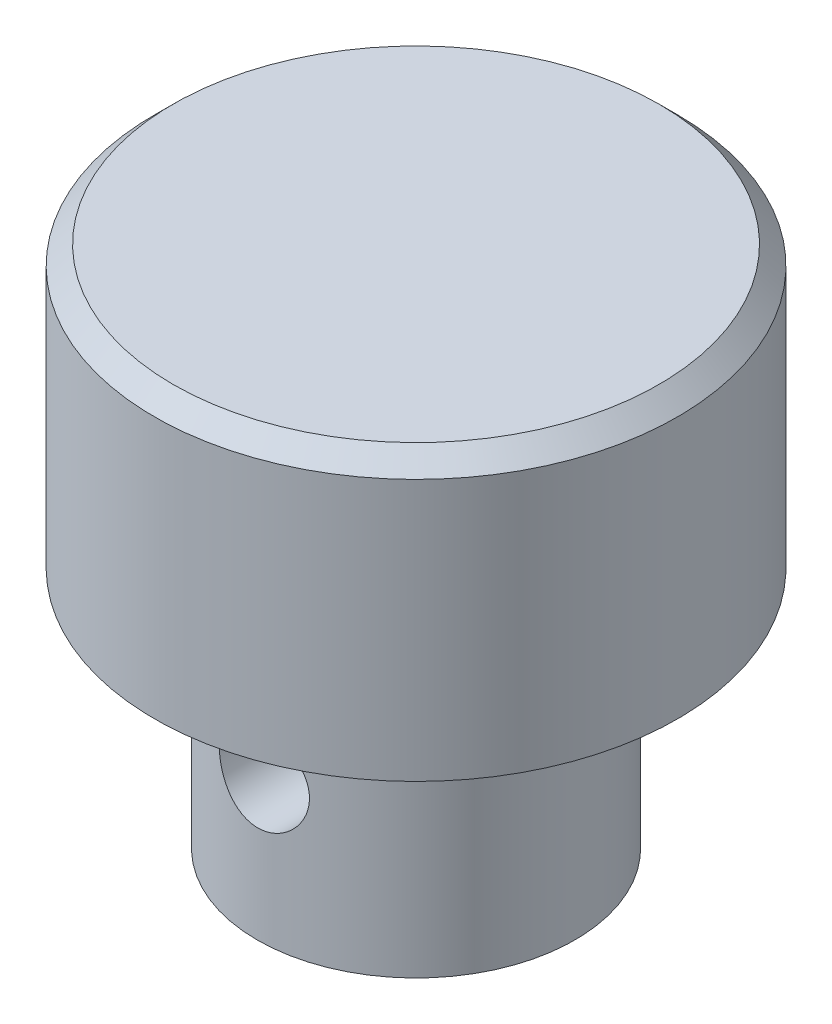
ISO-10303-21;
HEADER;
FILE_DESCRIPTION(('STEP AP214'),'2;1');
FILE_NAME('part.step','',(''),(''),'','','');
FILE_SCHEMA(('AUTOMOTIVE_DESIGN { 1 0 10303 214 1 1 1 1 }'));
ENDSEC;
DATA;
#1=APPLICATION_CONTEXT('core data for automotive mechanical design processes');
#2=APPLICATION_PROTOCOL_DEFINITION('international standard','automotive_design',2000,#1);
#3=PRODUCT_CONTEXT('',#1,'mechanical');
#4=PRODUCT('Part','Part','',(#3));
#5=PRODUCT_RELATED_PRODUCT_CATEGORY('part','',(#4));
#6=PRODUCT_DEFINITION_FORMATION('','',#4);
#7=PRODUCT_DEFINITION_CONTEXT('part definition',#1,'design');
#8=PRODUCT_DEFINITION('design','',#6,#7);
#9=PRODUCT_DEFINITION_SHAPE('','',#8);
#10=(LENGTH_UNIT() NAMED_UNIT(*) SI_UNIT(.MILLI.,.METRE.));
#11=(NAMED_UNIT(*) PLANE_ANGLE_UNIT() SI_UNIT($,.RADIAN.));
#12=(NAMED_UNIT(*) SI_UNIT($,.STERADIAN.) SOLID_ANGLE_UNIT());
#13=UNCERTAINTY_MEASURE_WITH_UNIT(LENGTH_MEASURE(1.E-05),#10,'distance_accuracy_value','');
#14=(GEOMETRIC_REPRESENTATION_CONTEXT(3) GLOBAL_UNCERTAINTY_ASSIGNED_CONTEXT((#13)) GLOBAL_UNIT_ASSIGNED_CONTEXT((#10,
#11,#12)) REPRESENTATION_CONTEXT('',''));
#15=CARTESIAN_POINT('',(0.,0.,0.));
#16=DIRECTION('',(0.,0.,1.));
#17=DIRECTION('',(1.,0.,0.));
#18=AXIS2_PLACEMENT_3D('',#15,#16,#17);
#19=CARTESIAN_POINT('',(0.,14.,0.));
#20=DIRECTION('',(0.,-1.,0.));
#21=DIRECTION('',(0.,0.,-1.));
#22=AXIS2_PLACEMENT_3D('',#19,#20,#21);
#23=PLANE('',#22);
#24=CARTESIAN_POINT('',(0.,14.,0.));
#25=DIRECTION('',(0.,-1.,0.));
#26=DIRECTION('',(0.,0.,-1.));
#27=AXIS2_PLACEMENT_3D('',#24,#25,#26);
#28=CIRCLE('',#27,6.5);
#29=CARTESIAN_POINT('',(0.,14.,-6.5));
#30=VERTEX_POINT('',#29);
#31=EDGE_CURVE('E10',#30,#30,#28,.F.);
#32=ORIENTED_EDGE('',*,*,#31,.T.);
#33=EDGE_LOOP('',(#32));
#34=FACE_BOUND('',#33,.T.);
#35=ADVANCED_FACE('F31',(#34),#23,.F.);
#36=CARTESIAN_POINT('',(0.,0.,0.));
#37=DIRECTION('',(0.,-1.,0.));
#38=DIRECTION('',(0.,0.,-1.));
#39=AXIS2_PLACEMENT_3D('',#36,#37,#38);
#40=CYLINDRICAL_SURFACE('',#39,7.);
#41=CARTESIAN_POINT('',(0.,13.5,0.));
#42=DIRECTION('',(0.,-1.,0.));
#43=DIRECTION('',(0.,0.,-1.));
#44=AXIS2_PLACEMENT_3D('',#41,#42,#43);
#45=CIRCLE('',#44,7.);
#46=CARTESIAN_POINT('',(0.,13.5,-7.));
#47=VERTEX_POINT('',#46);
#48=EDGE_CURVE('E38',#47,#47,#45,.T.);
#49=ORIENTED_EDGE('',*,*,#48,.T.);
#50=EDGE_LOOP('',(#49));
#51=FACE_BOUND('',#50,.T.);
#52=CARTESIAN_POINT('',(0.,6.5,0.));
#53=DIRECTION('',(0.,-1.,0.));
#54=DIRECTION('',(0.,0.,-1.));
#55=AXIS2_PLACEMENT_3D('',#52,#53,#54);
#56=CIRCLE('',#55,7.);
#57=CARTESIAN_POINT('',(0.,6.5,-7.));
#58=VERTEX_POINT('',#57);
#59=EDGE_CURVE('E42',#58,#58,#56,.T.);
#60=ORIENTED_EDGE('',*,*,#59,.F.);
#61=EDGE_LOOP('',(#60));
#62=FACE_BOUND('',#61,.T.);
#63=ADVANCED_FACE('F102',(#51,#62),#40,.T.);
#64=CARTESIAN_POINT('',(-7.,6.5,0.));
#65=DIRECTION('',(0.,1.,0.));
#66=DIRECTION('',(0.,0.,1.));
#67=AXIS2_PLACEMENT_3D('',#64,#65,#66);
#68=PLANE('',#67);
#69=CARTESIAN_POINT('',(0.,6.5,0.));
#70=DIRECTION('',(0.,-1.,0.));
#71=DIRECTION('',(0.,0.,-1.));
#72=AXIS2_PLACEMENT_3D('',#69,#70,#71);
#73=CIRCLE('',#72,4.25);
#74=CARTESIAN_POINT('',(0.,6.5,-4.25));
#75=VERTEX_POINT('',#74);
#76=EDGE_CURVE('E46',#75,#75,#73,.T.);
#77=ORIENTED_EDGE('',*,*,#76,.F.);
#78=EDGE_LOOP('',(#77));
#79=FACE_BOUND('',#78,.T.);
#80=ORIENTED_EDGE('',*,*,#59,.T.);
#81=EDGE_LOOP('',(#80));
#82=FACE_BOUND('',#81,.T.);
#83=ADVANCED_FACE('F97',(#79,#82),#68,.F.);
#84=CARTESIAN_POINT('',(0.,0.,0.));
#85=DIRECTION('',(0.,-1.,0.));
#86=DIRECTION('',(0.,0.,-1.));
#87=AXIS2_PLACEMENT_3D('',#84,#85,#86);
#88=CYLINDRICAL_SURFACE('',#87,4.25);
#89=CARTESIAN_POINT('',(1.21920959041759,3.80568373016986,4.07136684353471));
#90=CARTESIAN_POINT('',(1.21920832890433,3.7397374328764,4.07136781913721));
#91=CARTESIAN_POINT('',(1.21376262339111,3.67377824361565,4.07301006088089));
#92=CARTESIAN_POINT('',(1.19217100551096,3.54377550935095,4.07938120609931));
#93=CARTESIAN_POINT('',(1.17602055950048,3.4797327880205,4.08411141736998));
#94=CARTESIAN_POINT('',(1.13359946214554,3.35546290911904,4.09608756362742));
#95=CARTESIAN_POINT('',(1.10734421868117,3.2952301041802,4.10332966680737));
#96=CARTESIAN_POINT('',(1.0455054458652,3.18001784422204,4.11951888595602));
#97=CARTESIAN_POINT('',(1.0099208768711,3.1250389756238,4.12846619191895));
#98=CARTESIAN_POINT('',(0.929362775982501,3.02035405845796,4.14735278685746));
#99=CARTESIAN_POINT('',(0.884174013062863,2.97081710034123,4.15731147912593));
#100=CARTESIAN_POINT('',(0.786147985482681,2.87992207681794,4.17695660036339));
#101=CARTESIAN_POINT('',(0.733309845655741,2.83856494854981,4.18664299802747));
#102=CARTESIAN_POINT('',(0.620295782263802,2.76448518258169,4.20488562733698));
#103=CARTESIAN_POINT('',(0.560004227104671,2.73193261731746,4.21341819466145));
#104=CARTESIAN_POINT('',(0.434520958841596,2.67749856300077,4.22820011334349));
#105=CARTESIAN_POINT('',(0.369330179174537,2.65561504712025,4.23444989831075));
#106=CARTESIAN_POINT('',(0.23766288469119,2.62369315848721,4.24384960065228));
#107=CARTESIAN_POINT('',(0.171261664071204,2.61336669067937,4.24707457166408));
#108=CARTESIAN_POINT('',(0.0375949547385268,2.60394354656093,4.25035909468775));
#109=CARTESIAN_POINT('',(-0.029670370146834,2.60484477206451,4.25041923811879));
#110=CARTESIAN_POINT('',(-0.16114306494372,2.61765288500473,4.24743893578845));
#111=CARTESIAN_POINT('',(-0.225383143559765,2.62924819405231,4.24448601944478));
#112=CARTESIAN_POINT('',(-0.350978163539922,2.66260940904048,4.23595074079666));
#113=CARTESIAN_POINT('',(-0.412332930938086,2.68437592737729,4.23036822016674));
#114=CARTESIAN_POINT('',(-0.531184205753878,2.73768759430957,4.21710334816738));
#115=CARTESIAN_POINT('',(-0.588632087045439,2.76933545480794,4.20939904599085));
#116=CARTESIAN_POINT('',(-0.697511369858109,2.84143156697704,4.19273371960971));
#117=CARTESIAN_POINT('',(-0.748941475042961,2.88188170946906,4.18377242553745));
#118=CARTESIAN_POINT('',(-0.84618376342704,2.97207115072993,4.16521424805599));
#119=CARTESIAN_POINT('',(-0.89174273462881,3.02208148568489,4.15560610678199));
#120=CARTESIAN_POINT('',(-0.97389073187378,3.12912431742924,4.13712636026799));
#121=CARTESIAN_POINT('',(-1.01047906499303,3.18615735616638,4.12825481196002));
#122=CARTESIAN_POINT('',(-1.07386840609515,3.30622902630933,4.11222428559243));
#123=CARTESIAN_POINT('',(-1.10059253385561,3.36931019626831,4.10507890393446));
#124=CARTESIAN_POINT('',(-1.142956981512,3.49932251266354,4.09348716486688));
#125=CARTESIAN_POINT('',(-1.1586004386936,3.56625256355356,4.08904004354625));
#126=CARTESIAN_POINT('',(-1.17790362482243,3.69967480143977,4.08352068283485));
#127=CARTESIAN_POINT('',(-1.18194496040174,3.76610738967586,4.08234102068801));
#128=CARTESIAN_POINT('',(-1.1789866527937,3.89869985495441,4.08319643527745));
#129=CARTESIAN_POINT('',(-1.171988349424,3.96485976411336,4.08523112190671));
#130=CARTESIAN_POINT('',(-1.14748835383071,4.09350596842113,4.09217849803488));
#131=CARTESIAN_POINT('',(-1.130223427975,4.15604122121198,4.09702625409271));
#132=CARTESIAN_POINT('',(-1.08595217375622,4.27733011103158,4.10898164906093));
#133=CARTESIAN_POINT('',(-1.05894446315878,4.33608321008179,4.11608960861535));
#134=CARTESIAN_POINT('',(-0.99520591425156,4.44971414086434,4.13196874775118));
#135=CARTESIAN_POINT('',(-0.958255158170825,4.50446343556286,4.14077608271063));
#136=CARTESIAN_POINT('',(-0.875950467388223,4.60713108390788,4.15896425794176));
#137=CARTESIAN_POINT('',(-0.830594755146828,4.6550479887922,4.16834521924627));
#138=CARTESIAN_POINT('',(-0.730993559265198,4.74431120848244,4.18697908896269));
#139=CARTESIAN_POINT('',(-0.676504827312069,4.78538970191136,4.19621764700122));
#140=CARTESIAN_POINT('',(-0.561193630381252,4.85782853577558,4.21318795203537));
#141=CARTESIAN_POINT('',(-0.500371498978218,4.88918938768509,4.22091977832772));
#142=CARTESIAN_POINT('',(-0.374546720022602,4.94100482737196,4.23393198932885));
#143=CARTESIAN_POINT('',(-0.309580073948273,4.96154195205086,4.23923088526225));
#144=CARTESIAN_POINT('',(-0.176947287759567,4.99135560935044,4.24683364017173));
#145=CARTESIAN_POINT('',(-0.109281828868696,5.0006349652639,4.24913825008363));
#146=CARTESIAN_POINT('',(0.0243373766584333,5.00747525046429,4.25043760353639));
#147=CARTESIAN_POINT('',(0.0902703118674573,5.00542688461692,4.24954307310507));
#148=CARTESIAN_POINT('',(0.220800278709516,4.99058930289159,4.24476296610761));
#149=CARTESIAN_POINT('',(0.285397371585359,4.9778005805378,4.24087752697575));
#150=CARTESIAN_POINT('',(0.410893653375202,4.94207640317164,4.23055558842607));
#151=CARTESIAN_POINT('',(0.471819735828767,4.91922863229382,4.2241411832663));
#152=CARTESIAN_POINT('',(0.588998183440215,4.86411290055663,4.20940287271486));
#153=CARTESIAN_POINT('',(0.645249834680701,4.83184350413393,4.20107867637173));
#154=CARTESIAN_POINT('',(0.753268067527389,4.75770461544717,4.18308200492087));
#155=CARTESIAN_POINT('',(0.804855735958763,4.71558232773616,4.17337725908803));
#156=CARTESIAN_POINT('',(0.900360584346335,4.62340161753105,4.15382138774076));
#157=CARTESIAN_POINT('',(0.94427565778601,4.57334102274283,4.14397022282987));
#158=CARTESIAN_POINT('',(1.02430792511884,4.46517185181653,4.12492812867988));
#159=CARTESIAN_POINT('',(1.06019795351349,4.40689073340416,4.11576041381336));
#160=CARTESIAN_POINT('',(1.12163145034298,4.2848679040631,4.09944624591189));
#161=CARTESIAN_POINT('',(1.14718089095617,4.22112937089669,4.09229862689783));
#162=CARTESIAN_POINT('',(1.18433581908647,4.09908427501502,4.08168684026662));
#163=CARTESIAN_POINT('',(1.19738054587565,4.04124465461747,4.07785009408909));
#164=CARTESIAN_POINT('',(1.21481735319772,3.92416792834425,4.07268984482744));
#165=CARTESIAN_POINT('',(1.21921072378308,3.86493103215759,4.07136596703643));
#166=CARTESIAN_POINT('',(1.21920959041759,3.80568373016986,4.07136684353471));
#167=B_SPLINE_CURVE_WITH_KNOTS('',3,(#89,#90,#91,#92,#93,#94,#95,#96,#97,#98,#99,#100,#101,#102,
#103,#104,#105,#106,#107,#108,#109,#110,#111,#112,#113,#114,#115,#116,#117,#118,#119,#120,#121,
#122,#123,#124,#125,#126,#127,#128,#129,#130,#131,#132,#133,#134,#135,#136,#137,#138,#139,#140,
#141,#142,#143,#144,#145,#146,#147,#148,#149,#150,#151,#152,#153,#154,#155,#156,#157,#158,#159,
#160,#161,#162,#163,#164,#165,#166),.UNSPECIFIED.,.T.,.F.,(4,2,2,2,2,2,2,2,2,2,2,2,2,2,2,2,2,2,
2,2,2,2,2,2,2,2,2,2,2,2,2,2,2,2,2,2,2,2,4),(0.,0.19762072357327,0.395325196480535,
0.592729394723832,0.790155600677297,0.992588858413701,1.19504529490081,1.40117097122884,
1.60725747403373,1.80808351419102,2.0088720253549,2.20398918351715,2.39911809096147,
2.59634687712218,2.79361807196349,2.99765589027695,3.20170946423427,3.40732140422755,
3.61287510573131,3.81158583480373,4.01027244935041,4.20454561044397,4.39884634442631,
4.59785919789996,4.79691418815165,5.00251364941669,5.20810228740843,5.41209964624927,
5.61604583479026,5.81300255988095,6.00995023521743,6.20521410896021,6.40050775039806,
6.60150363272681,6.80255461219907,7.00872765997199,7.21478146255643,7.39235384313672,
7.56989974289327),.UNSPECIFIED.);
#168=CARTESIAN_POINT('',(1.21920959041759,3.80568373016986,4.07136684353471));
#169=VERTEX_POINT('',#168);
#170=EDGE_CURVE('E58',#169,#169,#167,.T.);
#171=ORIENTED_EDGE('',*,*,#170,.T.);
#172=EDGE_LOOP('',(#171));
#173=FACE_BOUND('',#172,.T.);
#174=CARTESIAN_POINT('',(0.,0.,0.));
#175=DIRECTION('',(0.,-1.,0.));
#176=DIRECTION('',(0.,0.,-1.));
#177=AXIS2_PLACEMENT_3D('',#174,#175,#176);
#178=CIRCLE('',#177,4.25);
#179=CARTESIAN_POINT('',(0.,0.,-4.25));
#180=VERTEX_POINT('',#179);
#181=EDGE_CURVE('E51',#180,#180,#178,.T.);
#182=ORIENTED_EDGE('',*,*,#181,.F.);
#183=EDGE_LOOP('',(#182));
#184=FACE_BOUND('',#183,.T.);
#185=ORIENTED_EDGE('',*,*,#76,.T.);
#186=EDGE_LOOP('',(#185));
#187=FACE_BOUND('',#186,.T.);
#188=ADVANCED_FACE('F71',(#173,#184,#187),#88,.T.);
#189=CARTESIAN_POINT('',(-4.25,0.,0.));
#190=DIRECTION('',(0.,1.,0.));
#191=DIRECTION('',(0.,0.,1.));
#192=AXIS2_PLACEMENT_3D('',#189,#190,#191);
#193=PLANE('',#192);
#194=CARTESIAN_POINT('',(0.,0.,0.));
#195=DIRECTION('',(0.,-1.,0.));
#196=DIRECTION('',(0.,0.,-1.));
#197=AXIS2_PLACEMENT_3D('',#194,#195,#196);
#198=CIRCLE('',#197,1.5);
#199=CARTESIAN_POINT('',(0.,0.,-1.5));
#200=VERTEX_POINT('',#199);
#201=EDGE_CURVE('E55',#200,#200,#198,.T.);
#202=ORIENTED_EDGE('',*,*,#201,.F.);
#203=EDGE_LOOP('',(#202));
#204=FACE_BOUND('',#203,.T.);
#205=ORIENTED_EDGE('',*,*,#181,.T.);
#206=EDGE_LOOP('',(#205));
#207=FACE_BOUND('',#206,.T.);
#208=ADVANCED_FACE('F89',(#204,#207),#193,.F.);
#209=CARTESIAN_POINT('',(0.,13.5,0.));
#210=DIRECTION('',(0.,-1.,0.));
#211=DIRECTION('',(0.,0.,-1.));
#212=AXIS2_PLACEMENT_3D('',#209,#210,#211);
#213=CONICAL_SURFACE('',#212,7.,0.785398163397449);
#214=ORIENTED_EDGE('',*,*,#31,.F.);
#215=EDGE_LOOP('',(#214));
#216=FACE_BOUND('',#215,.T.);
#217=ORIENTED_EDGE('',*,*,#48,.F.);
#218=EDGE_LOOP('',(#217));
#219=FACE_BOUND('',#218,.T.);
#220=ADVANCED_FACE('F33',(#216,#219),#213,.T.);
#221=CARTESIAN_POINT('',(0.,10.,0.));
#222=DIRECTION('',(0.,-1.,0.));
#223=DIRECTION('',(0.,0.,-1.));
#224=AXIS2_PLACEMENT_3D('',#221,#222,#223);
#225=CYLINDRICAL_SURFACE('',#224,1.5);
#226=CARTESIAN_POINT('',(1.20423006103565,3.80568373016986,0.894332130753493));
#227=CARTESIAN_POINT('',(1.20422409931287,3.85073234060299,0.894345813573895));
#228=CARTESIAN_POINT('',(1.20167983066978,3.89585108582603,0.897797725380765));
#229=CARTESIAN_POINT('',(1.19173437620972,3.98467244782763,0.910950013808097));
#230=CARTESIAN_POINT('',(1.1843165240581,4.02836966325714,0.920671829696659));
#231=CARTESIAN_POINT('',(1.1618170887931,4.12824698187499,0.949002593424484));
#232=CARTESIAN_POINT('',(1.14496546994049,4.18346923442959,0.969528089132049));
#233=CARTESIAN_POINT('',(1.10451811398975,4.28926461426663,1.01537080485693));
#234=CARTESIAN_POINT('',(1.08090336934401,4.33982409997014,1.04070146090854));
#235=CARTESIAN_POINT('',(1.01787819998889,4.45388752423816,1.10296287782676));
#236=CARTESIAN_POINT('',(0.975843663845468,4.51546367464623,1.14077681499808));
#237=CARTESIAN_POINT('',(0.880912763561575,4.63006983129719,1.21558808689791));
#238=CARTESIAN_POINT('',(0.828025452781937,4.68310689543819,1.25258607398295));
#239=CARTESIAN_POINT('',(0.723065920207439,4.76994668191634,1.31534949182968));
#240=CARTESIAN_POINT('',(0.672894599056176,4.8054794997803,1.34189037735715));
#241=CARTESIAN_POINT('',(0.566028430915812,4.86910330614963,1.39033760828187));
#242=CARTESIAN_POINT('',(0.509343920682424,4.89720585909038,1.41225114483442));
#243=CARTESIAN_POINT('',(0.400015365341511,4.94071150651825,1.44662391996389));
#244=CARTESIAN_POINT('',(0.348199941754671,4.95743326891552,1.46003892136321));
#245=CARTESIAN_POINT('',(0.241700117320936,4.98378294732225,1.48139235061677));
#246=CARTESIAN_POINT('',(0.187017303067043,4.99341474291588,1.48933377342629));
#247=CARTESIAN_POINT('',(0.0760979623346318,5.00499858614393,1.49910568271024));
#248=CARTESIAN_POINT('',(0.0198567297188972,5.00692404578304,1.50091500926578));
#249=CARTESIAN_POINT('',(-0.092186938387811,5.00288518924654,1.49821292081499));
#250=CARTESIAN_POINT('',(-0.147989353451961,4.99692050794873,1.49370121329747));
#251=CARTESIAN_POINT('',(-0.254438771498004,4.97804293838202,1.47918628596642));
#252=CARTESIAN_POINT('',(-0.305200997802009,4.96552643999621,1.4694957513292));
#253=CARTESIAN_POINT('',(-0.403692015043924,4.93446658961851,1.44554639206551));
#254=CARTESIAN_POINT('',(-0.451420036918442,4.91592171687131,1.43128641473586));
#255=CARTESIAN_POINT('',(-0.54753335284908,4.87152331101674,1.39751442399983));
#256=CARTESIAN_POINT('',(-0.595539069718251,4.84513782056103,1.37762880652794));
#257=CARTESIAN_POINT('',(-0.686540413920464,4.78696101441483,1.33461605749918));
#258=CARTESIAN_POINT('',(-0.729533213781453,4.755166672552,1.31148711262845));
#259=CARTESIAN_POINT('',(-0.818635979684102,4.67984660889054,1.25819482786811));
#260=CARTESIAN_POINT('',(-0.863562423745024,4.63525356164693,1.2275641104165));
#261=CARTESIAN_POINT('',(-0.945745967538966,4.5399301879794,1.16542630776325));
#262=CARTESIAN_POINT('',(-0.982993595433885,4.48919240296529,1.13391819400057));
#263=CARTESIAN_POINT('',(-1.04631149982412,4.38695161267909,1.07559310268103));
#264=CARTESIAN_POINT('',(-1.07311286189884,4.33599316586163,1.04861660981831));
#265=CARTESIAN_POINT('',(-1.11963793827041,4.22906385036914,0.998782703748473));
#266=CARTESIAN_POINT('',(-1.13937712331794,4.17310427796727,0.975916342093359));
#267=CARTESIAN_POINT('',(-1.16593591388406,4.0740087677532,0.943870579383092));
#268=CARTESIAN_POINT('',(-1.1748575122877,4.03211603163111,0.932643299800397));
#269=CARTESIAN_POINT('',(-1.18817804798358,3.94657560659736,0.915616131728873));
#270=CARTESIAN_POINT('',(-1.19258706860071,3.90293205782346,0.909804145421884));
#271=CARTESIAN_POINT('',(-1.19652809219927,3.81476570341343,0.90461829268651));
#272=CARTESIAN_POINT('',(-1.19603182963449,3.77023927913539,0.905281739148379));
#273=CARTESIAN_POINT('',(-1.19014417724938,3.68205533514741,0.913004281804997));
#274=CARTESIAN_POINT('',(-1.1847458802757,3.63839913033738,0.920072402399777));
#275=CARTESIAN_POINT('',(-1.1675609635522,3.54224580857276,0.941824438291834));
#276=CARTESIAN_POINT('',(-1.15449858217352,3.49032476929135,0.95798830862297));
#277=CARTESIAN_POINT('',(-1.12236741900293,3.39030921051857,0.995439757186718));
#278=CARTESIAN_POINT('',(-1.1032807301962,3.342226641628,1.01674256562599));
#279=CARTESIAN_POINT('',(-1.04980116535058,3.22876637256028,1.0723811145662));
#280=CARTESIAN_POINT('',(-1.01240118988475,3.16554652957476,1.10821906233605));
#281=CARTESIAN_POINT('',(-0.927072403128299,3.04705324062465,1.18054528343974));
#282=CARTESIAN_POINT('',(-0.87913120064074,2.99178927435978,1.21703427529979));
#283=CARTESIAN_POINT('',(-0.772151448036286,2.88920604576284,1.28761471518694));
#284=CARTESIAN_POINT('',(-0.712965585517155,2.84201015270202,1.32166497294986));
#285=CARTESIAN_POINT('',(-0.584466703010723,2.75852381370335,1.38326934802904));
#286=CARTESIAN_POINT('',(-0.515187674692898,2.72219796676748,1.41084448857823));
#287=CARTESIAN_POINT('',(-0.391892420857056,2.67258937768973,1.44884280413982));
#288=CARTESIAN_POINT('',(-0.340155905724423,2.6556533039854,1.46192957586262));
#289=CARTESIAN_POINT('',(-0.233831307252753,2.62882444919148,1.48264827062895));
#290=CARTESIAN_POINT('',(-0.179245434993124,2.6189262914455,1.49028435777177));
#291=CARTESIAN_POINT('',(-0.0685077532125972,2.60676803570705,1.49946787153305));
#292=CARTESIAN_POINT('',(-0.0123509766648186,2.60453580713488,1.50099308546445));
#293=CARTESIAN_POINT('',(0.0995404780894656,2.607943635729,1.49773964534848));
#294=CARTESIAN_POINT('',(0.155275126296487,2.61358424721484,1.49296054742151));
#295=CARTESIAN_POINT('',(0.261662157609101,2.6318458584246,1.47792677003257));
#296=CARTESIAN_POINT('',(0.312426923121623,2.64407732901157,1.46797866067954));
#297=CARTESIAN_POINT('',(0.410922879939617,2.67459578295795,1.44350980123998));
#298=CARTESIAN_POINT('',(0.458653281743992,2.69288433466548,1.42898786690969));
#299=CARTESIAN_POINT('',(0.554612257882334,2.7367084568054,1.39471778704925));
#300=CARTESIAN_POINT('',(0.602473877275867,2.76276003543646,1.37460906413159));
#301=CARTESIAN_POINT('',(0.693202384194193,2.82026913242665,1.33116680055983));
#302=CARTESIAN_POINT('',(0.73606659943847,2.85172952101097,1.30783154901802));
#303=CARTESIAN_POINT('',(0.824851575827675,2.92626145797208,1.25412597156593));
#304=CARTESIAN_POINT('',(0.869602179504805,2.97039157815912,1.22329331521236));
#305=CARTESIAN_POINT('',(0.951499428026104,3.06475388548391,1.16073456600781));
#306=CARTESIAN_POINT('',(0.988636503818128,3.11499362673307,1.12900740515296));
#307=CARTESIAN_POINT('',(1.0523628040286,3.21705825688762,1.06970486908752));
#308=CARTESIAN_POINT('',(1.07956175859314,3.26842724289951,1.0420011473062));
#309=CARTESIAN_POINT('',(1.12678159504302,3.37631886312069,0.990743062637815));
#310=CARTESIAN_POINT('',(1.14681591516575,3.43283159699251,0.967180974237524));
#311=CARTESIAN_POINT('',(1.17390138641333,3.53336732622147,0.933956179131819));
#312=CARTESIAN_POINT('',(1.18304025039447,3.57613545681418,0.922243672350935));
#313=CARTESIAN_POINT('',(1.19663580549478,3.66349829275239,0.90454088364353));
#314=CARTESIAN_POINT('',(1.2011103201516,3.70808536333663,0.898528827030234));
#315=CARTESIAN_POINT('',(1.20384693629776,3.77047885877526,0.894846703657692));
#316=CARTESIAN_POINT('',(1.20423239124694,3.78807593711594,0.894326782658008));
#317=CARTESIAN_POINT('',(1.20423006103565,3.80568373016986,0.894332130753493));
#318=B_SPLINE_CURVE_WITH_KNOTS('',3,(#226,#227,#228,#229,#230,#231,#232,#233,#234,#235,#236,
#237,#238,#239,#240,#241,#242,#243,#244,#245,#246,#247,#248,#249,#250,#251,#252,#253,#254,#255,
#256,#257,#258,#259,#260,#261,#262,#263,#264,#265,#266,#267,#268,#269,#270,#271,#272,#273,#274,
#275,#276,#277,#278,#279,#280,#281,#282,#283,#284,#285,#286,#287,#288,#289,#290,#291,#292,#293,
#294,#295,#296,#297,#298,#299,#300,#301,#302,#303,#304,#305,#306,#307,#308,#309,#310,#311,#312,
#313,#314,#315,#316,#317),.UNSPECIFIED.,.T.,.F.,(4,2,2,2,2,2,2,2,2,2,2,2,2,2,2,2,2,2,2,2,2,2,2,
2,2,2,2,2,2,2,2,2,2,2,2,2,2,2,2,2,2,2,2,2,2,4),(0.,0.135084491287974,0.27063335633701,
0.453428630796527,0.636742773569782,0.886324827670038,1.13569952122127,1.33583581907458,
1.53565876710614,1.70317256661106,1.87059463536562,2.03859383956756,2.20660081833124,
2.36545150500777,2.52434229548774,2.69853906413055,2.8728336157569,3.08304735927841,
3.29351887062639,3.48371516030978,3.6734922080222,3.805846357709,3.93790411296248,
4.07072326169671,4.20372984856053,4.37057136226315,4.53791355178446,4.78185487185398,
5.0260844923714,5.27376704968889,5.52063396155904,5.68791556567888,5.85506923634548,
6.02282995313261,6.19060248239613,6.34940065189869,6.50823997088734,6.68186015305211,
6.8555727540476,7.06484111434693,7.27437090226762,7.46697444552421,7.65921481638088,
7.79454829960206,7.92936272574331,7.98216212942132),.UNSPECIFIED.);
#319=CARTESIAN_POINT('',(1.20423006103565,3.80568373016986,0.894332130753493));
#320=VERTEX_POINT('',#319);
#321=EDGE_CURVE('E67',#320,#320,#318,.T.);
#322=ORIENTED_EDGE('',*,*,#321,.T.);
#323=EDGE_LOOP('',(#322));
#324=FACE_BOUND('',#323,.T.);
#325=CARTESIAN_POINT('',(0.,10.,0.));
#326=DIRECTION('',(0.,-1.,0.));
#327=DIRECTION('',(0.,0.,-1.));
#328=AXIS2_PLACEMENT_3D('',#325,#326,#327);
#329=CIRCLE('',#328,1.5);
#330=CARTESIAN_POINT('',(0.,10.,-1.5));
#331=VERTEX_POINT('',#330);
#332=EDGE_CURVE('E54',#331,#331,#329,.T.);
#333=ORIENTED_EDGE('',*,*,#332,.F.);
#334=EDGE_LOOP('',(#333));
#335=FACE_BOUND('',#334,.T.);
#336=ORIENTED_EDGE('',*,*,#201,.T.);
#337=EDGE_LOOP('',(#336));
#338=FACE_BOUND('',#337,.T.);
#339=ADVANCED_FACE('F85',(#324,#335,#338),#225,.F.);
#340=CARTESIAN_POINT('',(0.,10.,0.));
#341=DIRECTION('',(0.,-1.,0.));
#342=DIRECTION('',(0.,0.,-1.));
#343=AXIS2_PLACEMENT_3D('',#340,#341,#342);
#344=PLANE('',#343);
#345=ORIENTED_EDGE('',*,*,#332,.T.);
#346=EDGE_LOOP('',(#345));
#347=FACE_BOUND('',#346,.T.);
#348=ADVANCED_FACE('F78',(#347),#344,.T.);
#349=CARTESIAN_POINT('',(0.0200382740527184,3.80568373016986,4.2499527606284));
#350=DIRECTION('',(0.0047148880124045,0.,0.999988884853742));
#351=DIRECTION('',(0.999988884853742,0.,-0.0047148880124045));
#352=AXIS2_PLACEMENT_3D('',#349,#350,#351);
#353=CYLINDRICAL_SURFACE('',#352,1.19999999999999);
#354=ORIENTED_EDGE('',*,*,#321,.F.);
#355=EDGE_LOOP('',(#354));
#356=FACE_BOUND('',#355,.T.);
#357=ORIENTED_EDGE('',*,*,#170,.F.);
#358=EDGE_LOOP('',(#357));
#359=FACE_BOUND('',#358,.T.);
#360=ADVANCED_FACE('F75',(#356,#359),#353,.F.);
#361=CLOSED_SHELL('',(#35,#63,#83,#188,#208,#220,#339,#348,#360));
#362=MANIFOLD_SOLID_BREP('B2',#361);
#363=ADVANCED_BREP_SHAPE_REPRESENTATION('',(#18,#362),#14);
#364=SHAPE_DEFINITION_REPRESENTATION(#9,#363);
ENDSEC;
END-ISO-10303-21;
